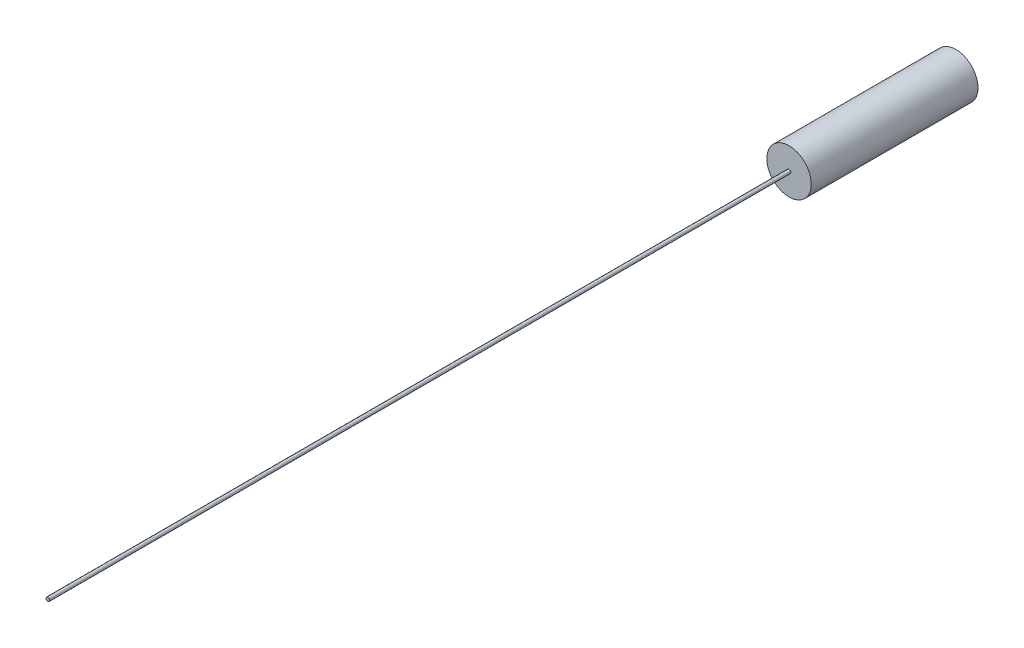
ISO-10303-21;
HEADER;
FILE_DESCRIPTION(('STEP AP214'),'2;1');
FILE_NAME('part.step','',(''),(''),'','','');
FILE_SCHEMA(('AUTOMOTIVE_DESIGN { 1 0 10303 214 1 1 1 1 }'));
ENDSEC;
DATA;
#1=APPLICATION_CONTEXT('core data for automotive mechanical design processes');
#2=APPLICATION_PROTOCOL_DEFINITION('international standard','automotive_design',2000,#1);
#3=PRODUCT_CONTEXT('',#1,'mechanical');
#4=PRODUCT('Part','Part','',(#3));
#5=PRODUCT_RELATED_PRODUCT_CATEGORY('part','',(#4));
#6=PRODUCT_DEFINITION_FORMATION('','',#4);
#7=PRODUCT_DEFINITION_CONTEXT('part definition',#1,'design');
#8=PRODUCT_DEFINITION('design','',#6,#7);
#9=PRODUCT_DEFINITION_SHAPE('','',#8);
#10=(LENGTH_UNIT() NAMED_UNIT(*) SI_UNIT(.MILLI.,.METRE.));
#11=(NAMED_UNIT(*) PLANE_ANGLE_UNIT() SI_UNIT($,.RADIAN.));
#12=(NAMED_UNIT(*) SI_UNIT($,.STERADIAN.) SOLID_ANGLE_UNIT());
#13=UNCERTAINTY_MEASURE_WITH_UNIT(LENGTH_MEASURE(1.E-05),#10,'distance_accuracy_value','');
#14=(GEOMETRIC_REPRESENTATION_CONTEXT(3) GLOBAL_UNCERTAINTY_ASSIGNED_CONTEXT((#13)) GLOBAL_UNIT_ASSIGNED_CONTEXT((#10,
#11,#12)) REPRESENTATION_CONTEXT('',''));
#15=CARTESIAN_POINT('',(0.,0.,0.));
#16=DIRECTION('',(0.,0.,1.));
#17=DIRECTION('',(1.,0.,0.));
#18=AXIS2_PLACEMENT_3D('',#15,#16,#17);
#19=CARTESIAN_POINT('',(0.,0.,45.));
#20=DIRECTION('',(0.,0.,-1.));
#21=DIRECTION('',(-1.,0.,0.));
#22=AXIS2_PLACEMENT_3D('',#19,#20,#21);
#23=CYLINDRICAL_SURFACE('',#22,6.);
#24=CARTESIAN_POINT('',(0.,0.,45.));
#25=DIRECTION('',(0.,0.,1.));
#26=DIRECTION('',(1.,0.,0.));
#27=AXIS2_PLACEMENT_3D('',#24,#25,#26);
#28=CIRCLE('',#27,6.);
#29=CARTESIAN_POINT('',(-6.,0.,45.));
#30=VERTEX_POINT('',#29);
#31=EDGE_CURVE('E10',#30,#30,#28,.T.);
#32=CARTESIAN_POINT('',(0.,0.,0.));
#33=DIRECTION('',(0.,0.,1.));
#34=DIRECTION('',(1.,0.,0.));
#35=AXIS2_PLACEMENT_3D('',#32,#33,#34);
#36=CIRCLE('',#35,6.);
#37=CARTESIAN_POINT('',(-6.,0.,0.));
#38=VERTEX_POINT('',#37);
#39=EDGE_CURVE('E38',#38,#38,#36,.T.);
#40=CARTESIAN_POINT('',(-6.,0.,45.));
#41=CARTESIAN_POINT('',(-6.,0.,44.53125));
#42=CARTESIAN_POINT('',(-6.,0.,44.0625));
#43=CARTESIAN_POINT('',(-6.,0.,43.125));
#44=CARTESIAN_POINT('',(-6.,0.,42.65625));
#45=CARTESIAN_POINT('',(-6.,0.,41.71875));
#46=CARTESIAN_POINT('',(-6.,0.,41.25));
#47=CARTESIAN_POINT('',(-6.,0.,40.3125));
#48=CARTESIAN_POINT('',(-6.,0.,39.84375));
#49=CARTESIAN_POINT('',(-6.,0.,38.90625));
#50=CARTESIAN_POINT('',(-6.,0.,38.4375));
#51=CARTESIAN_POINT('',(-6.,0.,37.5));
#52=CARTESIAN_POINT('',(-6.,0.,37.03125));
#53=CARTESIAN_POINT('',(-6.,0.,36.09375));
#54=CARTESIAN_POINT('',(-6.,0.,35.625));
#55=CARTESIAN_POINT('',(-6.,0.,34.6875));
#56=CARTESIAN_POINT('',(-6.,0.,34.21875));
#57=CARTESIAN_POINT('',(-6.,0.,33.28125));
#58=CARTESIAN_POINT('',(-6.,0.,32.8125));
#59=CARTESIAN_POINT('',(-6.,0.,31.875));
#60=CARTESIAN_POINT('',(-6.,0.,31.40625));
#61=CARTESIAN_POINT('',(-6.,0.,30.46875));
#62=CARTESIAN_POINT('',(-6.,0.,30.));
#63=CARTESIAN_POINT('',(-6.,0.,29.0625));
#64=CARTESIAN_POINT('',(-6.,0.,28.59375));
#65=CARTESIAN_POINT('',(-6.,0.,27.65625));
#66=CARTESIAN_POINT('',(-6.,0.,27.1875));
#67=CARTESIAN_POINT('',(-6.,0.,26.25));
#68=CARTESIAN_POINT('',(-6.,0.,25.78125));
#69=CARTESIAN_POINT('',(-6.,0.,24.84375));
#70=CARTESIAN_POINT('',(-6.,0.,24.375));
#71=CARTESIAN_POINT('',(-6.,0.,23.4375));
#72=CARTESIAN_POINT('',(-6.,0.,22.96875));
#73=CARTESIAN_POINT('',(-6.,0.,22.03125));
#74=CARTESIAN_POINT('',(-6.,0.,21.5625));
#75=CARTESIAN_POINT('',(-6.,0.,20.625));
#76=CARTESIAN_POINT('',(-6.,0.,20.15625));
#77=CARTESIAN_POINT('',(-6.,0.,19.21875));
#78=CARTESIAN_POINT('',(-6.,0.,18.75));
#79=CARTESIAN_POINT('',(-6.,0.,17.8125));
#80=CARTESIAN_POINT('',(-6.,0.,17.34375));
#81=CARTESIAN_POINT('',(-6.,0.,16.40625));
#82=CARTESIAN_POINT('',(-6.,0.,15.9375));
#83=CARTESIAN_POINT('',(-6.,0.,15.));
#84=CARTESIAN_POINT('',(-6.,0.,14.53125));
#85=CARTESIAN_POINT('',(-6.,0.,13.59375));
#86=CARTESIAN_POINT('',(-6.,0.,13.125));
#87=CARTESIAN_POINT('',(-6.,0.,12.1875));
#88=CARTESIAN_POINT('',(-6.,0.,11.71875));
#89=CARTESIAN_POINT('',(-6.,0.,10.78125));
#90=CARTESIAN_POINT('',(-6.,0.,10.3125));
#91=CARTESIAN_POINT('',(-6.,0.,9.37499999999999));
#92=CARTESIAN_POINT('',(-6.,0.,8.90624999999999));
#93=CARTESIAN_POINT('',(-6.,0.,7.96874999999999));
#94=CARTESIAN_POINT('',(-6.,0.,7.5));
#95=CARTESIAN_POINT('',(-6.,0.,6.56249999999999));
#96=CARTESIAN_POINT('',(-6.,0.,6.09374999999999));
#97=CARTESIAN_POINT('',(-6.,0.,5.15624999999999));
#98=CARTESIAN_POINT('',(-6.,0.,4.68749999999999));
#99=CARTESIAN_POINT('',(-6.,0.,3.74999999999999));
#100=CARTESIAN_POINT('',(-6.,0.,3.28124999999999));
#101=CARTESIAN_POINT('',(-6.,0.,2.34374999999999));
#102=CARTESIAN_POINT('',(-6.,0.,1.87499999999999));
#103=CARTESIAN_POINT('',(-6.,0.,0.937499999999992));
#104=CARTESIAN_POINT('',(-6.,0.,0.468749999999993));
#105=CARTESIAN_POINT('',(-6.,0.,0.));
#106=B_SPLINE_CURVE_WITH_KNOTS('',3,(#40,#41,#42,#43,#44,#45,#46,#47,#48,#49,#50,#51,#52,#53,
#54,#55,#56,#57,#58,#59,#60,#61,#62,#63,#64,#65,#66,#67,#68,#69,#70,#71,#72,#73,#74,#75,#76,#77,
#78,#79,#80,#81,#82,#83,#84,#85,#86,#87,#88,#89,#90,#91,#92,#93,#94,#95,#96,#97,#98,#99,#100,
#101,#102,#103,#104,#105),.UNSPECIFIED.,.F.,.F.,(4,2,2,2,2,2,2,2,2,2,2,2,2,2,2,2,2,2,2,2,2,2,2,
2,2,2,2,2,2,2,2,2,4),(0.,1.40625,2.8125,4.21874999999999,5.625,7.03125,8.43749999999999,9.84375,
11.25,12.65625,14.0625,15.46875,16.875,18.28125,19.6875,21.09375,22.5,23.90625,25.3125,26.71875,
28.125,29.53125,30.9375,32.34375,33.75,35.15625,36.5625,37.96875,39.375,40.78125,42.1875,
43.59375,45.),.UNSPECIFIED.);
#107=EDGE_CURVE('BSEAM35',#30,#38,#106,.T.);
#108=ORIENTED_EDGE('',*,*,#31,.F.);
#109=ORIENTED_EDGE('',*,*,#39,.T.);
#110=ORIENTED_EDGE('',*,*,#107,.T.);
#111=ORIENTED_EDGE('',*,*,#107,.F.);
#112=EDGE_LOOP('',(#108,#110,#109,#111));
#113=FACE_BOUND('',#112,.T.);
#114=ADVANCED_FACE('F35',(#113),#23,.T.);
#115=CARTESIAN_POINT('',(0.,0.,45.));
#116=DIRECTION('',(0.,0.,1.));
#117=DIRECTION('',(1.,0.,0.));
#118=AXIS2_PLACEMENT_3D('',#115,#116,#117);
#119=PLANE('',#118);
#120=CARTESIAN_POINT('',(0.,0.,45.));
#121=DIRECTION('',(0.,0.,1.));
#122=DIRECTION('',(1.,0.,0.));
#123=AXIS2_PLACEMENT_3D('',#120,#121,#122);
#124=CIRCLE('',#123,0.5);
#125=CARTESIAN_POINT('',(0.5,0.,45.));
#126=VERTEX_POINT('',#125);
#127=EDGE_CURVE('E47',#126,#126,#124,.T.);
#128=ORIENTED_EDGE('',*,*,#127,.F.);
#129=EDGE_LOOP('',(#128));
#130=FACE_BOUND('',#129,.T.);
#131=ORIENTED_EDGE('',*,*,#31,.T.);
#132=EDGE_LOOP('',(#131));
#133=FACE_BOUND('',#132,.T.);
#134=ADVANCED_FACE('F62',(#130,#133),#119,.T.);
#135=CARTESIAN_POINT('',(0.,0.,0.));
#136=DIRECTION('',(0.,0.,1.));
#137=DIRECTION('',(1.,0.,0.));
#138=AXIS2_PLACEMENT_3D('',#135,#136,#137);
#139=PLANE('',#138);
#140=ORIENTED_EDGE('',*,*,#39,.F.);
#141=EDGE_LOOP('',(#140));
#142=FACE_BOUND('',#141,.T.);
#143=ADVANCED_FACE('F58',(#142),#139,.F.);
#144=CARTESIAN_POINT('',(0.,0.,245.));
#145=DIRECTION('',(0.,0.,-1.));
#146=DIRECTION('',(-1.,0.,0.));
#147=AXIS2_PLACEMENT_3D('',#144,#145,#146);
#148=CYLINDRICAL_SURFACE('',#147,0.5);
#149=CARTESIAN_POINT('',(0.,0.,245.));
#150=DIRECTION('',(0.,0.,1.));
#151=DIRECTION('',(1.,0.,0.));
#152=AXIS2_PLACEMENT_3D('',#149,#150,#151);
#153=CIRCLE('',#152,0.5);
#154=CARTESIAN_POINT('',(0.5,0.,245.));
#155=VERTEX_POINT('',#154);
#156=EDGE_CURVE('E45',#155,#155,#153,.T.);
#157=ORIENTED_EDGE('',*,*,#156,.F.);
#158=EDGE_LOOP('',(#157));
#159=FACE_BOUND('',#158,.T.);
#160=ORIENTED_EDGE('',*,*,#127,.T.);
#161=EDGE_LOOP('',(#160));
#162=FACE_BOUND('',#161,.T.);
#163=ADVANCED_FACE('F55',(#159,#162),#148,.T.);
#164=CARTESIAN_POINT('',(0.,0.,245.));
#165=DIRECTION('',(0.,0.,1.));
#166=DIRECTION('',(1.,0.,0.));
#167=AXIS2_PLACEMENT_3D('',#164,#165,#166);
#168=PLANE('',#167);
#169=ORIENTED_EDGE('',*,*,#156,.T.);
#170=EDGE_LOOP('',(#169));
#171=FACE_BOUND('',#170,.T.);
#172=ADVANCED_FACE('F53',(#171),#168,.T.);
#173=CLOSED_SHELL('',(#114,#134,#143,#163,#172));
#174=MANIFOLD_SOLID_BREP('B2',#173);
#175=ADVANCED_BREP_SHAPE_REPRESENTATION('',(#18,#174),#14);
#176=SHAPE_DEFINITION_REPRESENTATION(#9,#175);
ENDSEC;
END-ISO-10303-21;
